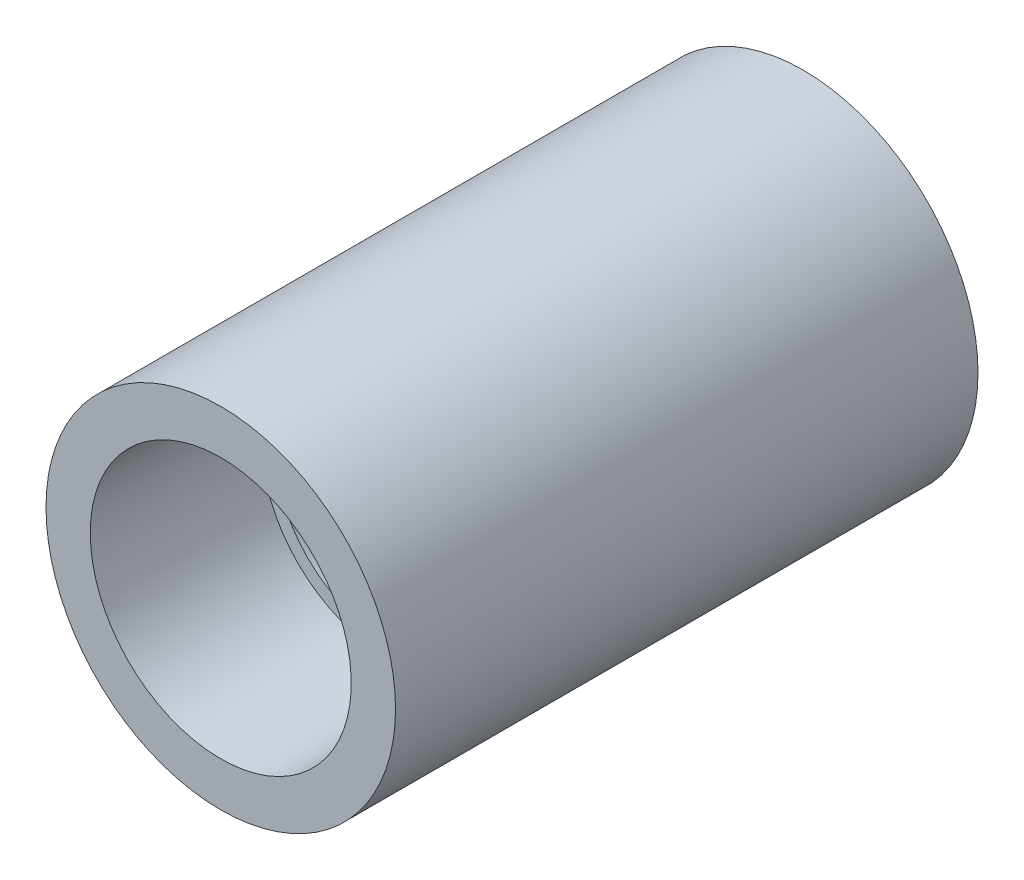
ISO-10303-21;
HEADER;
FILE_DESCRIPTION(('STEP AP214'),'2;1');
FILE_NAME('part.step','',(''),(''),'','','');
FILE_SCHEMA(('AUTOMOTIVE_DESIGN { 1 0 10303 214 1 1 1 1 }'));
ENDSEC;
DATA;
#1=APPLICATION_CONTEXT('core data for automotive mechanical design processes');
#2=APPLICATION_PROTOCOL_DEFINITION('international standard','automotive_design',2000,#1);
#3=PRODUCT_CONTEXT('',#1,'mechanical');
#4=PRODUCT('Part','Part','',(#3));
#5=PRODUCT_RELATED_PRODUCT_CATEGORY('part','',(#4));
#6=PRODUCT_DEFINITION_FORMATION('','',#4);
#7=PRODUCT_DEFINITION_CONTEXT('part definition',#1,'design');
#8=PRODUCT_DEFINITION('design','',#6,#7);
#9=PRODUCT_DEFINITION_SHAPE('','',#8);
#10=(LENGTH_UNIT() NAMED_UNIT(*) SI_UNIT(.MILLI.,.METRE.));
#11=(NAMED_UNIT(*) PLANE_ANGLE_UNIT() SI_UNIT($,.RADIAN.));
#12=(NAMED_UNIT(*) SI_UNIT($,.STERADIAN.) SOLID_ANGLE_UNIT());
#13=UNCERTAINTY_MEASURE_WITH_UNIT(LENGTH_MEASURE(1.E-05),#10,'distance_accuracy_value','');
#14=(GEOMETRIC_REPRESENTATION_CONTEXT(3) GLOBAL_UNCERTAINTY_ASSIGNED_CONTEXT((#13)) GLOBAL_UNIT_ASSIGNED_CONTEXT((#10,
#11,#12)) REPRESENTATION_CONTEXT('',''));
#15=CARTESIAN_POINT('',(0.,0.,0.));
#16=DIRECTION('',(0.,0.,1.));
#17=DIRECTION('',(1.,0.,0.));
#18=AXIS2_PLACEMENT_3D('',#15,#16,#17);
#19=CARTESIAN_POINT('',(-1.11022302462516E-12,-9.99200722162641E-13,47.625));
#20=DIRECTION('',(0.,0.,-1.));
#21=DIRECTION('',(-1.,0.,0.));
#22=AXIS2_PLACEMENT_3D('',#19,#20,#21);
#23=CYLINDRICAL_SURFACE('',#22,14.2875);
#24=CARTESIAN_POINT('',(-1.11022302462516E-12,-9.99200722162641E-13,47.625));
#25=DIRECTION('',(0.,0.,1.));
#26=DIRECTION('',(1.,0.,0.));
#27=AXIS2_PLACEMENT_3D('',#24,#25,#26);
#28=CIRCLE('',#27,14.2875);
#29=CARTESIAN_POINT('',(14.2874999999989,-1.01109745576089E-12,47.625));
#30=VERTEX_POINT('',#29);
#31=EDGE_CURVE('E10',#30,#30,#28,.T.);
#32=ORIENTED_EDGE('',*,*,#31,.F.);
#33=EDGE_LOOP('',(#32));
#34=FACE_BOUND('',#33,.T.);
#35=CARTESIAN_POINT('',(0.,0.,0.));
#36=DIRECTION('',(0.,0.,1.));
#37=DIRECTION('',(1.,0.,0.));
#38=AXIS2_PLACEMENT_3D('',#35,#36,#37);
#39=CIRCLE('',#38,14.2875);
#40=CARTESIAN_POINT('',(14.2875,0.,0.));
#41=VERTEX_POINT('',#40);
#42=EDGE_CURVE('E37',#41,#41,#39,.T.);
#43=ORIENTED_EDGE('',*,*,#42,.T.);
#44=EDGE_LOOP('',(#43));
#45=FACE_BOUND('',#44,.T.);
#46=ADVANCED_FACE('F30',(#34,#45),#23,.T.);
#47=CARTESIAN_POINT('',(-1.11022302462516E-12,-9.99200722162641E-13,47.625));
#48=DIRECTION('',(0.,0.,1.));
#49=DIRECTION('',(1.,0.,0.));
#50=AXIS2_PLACEMENT_3D('',#47,#48,#49);
#51=PLANE('',#50);
#52=CARTESIAN_POINT('',(-1.11022302462516E-12,-9.99200722162641E-13,47.625));
#53=DIRECTION('',(0.,0.,-1.));
#54=DIRECTION('',(-1.,0.,0.));
#55=AXIS2_PLACEMENT_3D('',#52,#53,#54);
#56=CIRCLE('',#55,10.668);
#57=CARTESIAN_POINT('',(-10.6680000000011,-9.90317827742615E-13,47.625));
#58=VERTEX_POINT('',#57);
#59=EDGE_CURVE('E51',#58,#58,#56,.T.);
#60=ORIENTED_EDGE('',*,*,#59,.T.);
#61=EDGE_LOOP('',(#60));
#62=FACE_BOUND('',#61,.T.);
#63=ORIENTED_EDGE('',*,*,#31,.T.);
#64=EDGE_LOOP('',(#63));
#65=FACE_BOUND('',#64,.T.);
#66=ADVANCED_FACE('F86',(#62,#65),#51,.T.);
#67=CARTESIAN_POINT('',(0.,0.,0.));
#68=DIRECTION('',(0.,0.,1.));
#69=DIRECTION('',(1.,0.,0.));
#70=AXIS2_PLACEMENT_3D('',#67,#68,#69);
#71=PLANE('',#70);
#72=CARTESIAN_POINT('',(0.,0.,0.));
#73=DIRECTION('',(0.,0.,-1.));
#74=DIRECTION('',(-1.,0.,0.));
#75=AXIS2_PLACEMENT_3D('',#72,#73,#74);
#76=CIRCLE('',#75,8.5725);
#77=CARTESIAN_POINT('',(-8.57250000000003,0.,0.));
#78=VERTEX_POINT('',#77);
#79=EDGE_CURVE('E59',#78,#78,#76,.T.);
#80=ORIENTED_EDGE('',*,*,#79,.F.);
#81=EDGE_LOOP('',(#80));
#82=FACE_BOUND('',#81,.T.);
#83=ORIENTED_EDGE('',*,*,#42,.F.);
#84=EDGE_LOOP('',(#83));
#85=FACE_BOUND('',#84,.T.);
#86=ADVANCED_FACE('F91',(#82,#85),#71,.F.);
#87=CARTESIAN_POINT('',(0.,0.,34.0613999999999));
#88=DIRECTION('',(0.,0.,-1.));
#89=DIRECTION('',(-1.,0.,0.));
#90=AXIS2_PLACEMENT_3D('',#87,#88,#89);
#91=PLANE('',#90);
#92=CARTESIAN_POINT('',(0.,0.,34.0613999999999));
#93=DIRECTION('',(0.,0.,-1.));
#94=DIRECTION('',(-1.,0.,0.));
#95=AXIS2_PLACEMENT_3D('',#92,#93,#94);
#96=CIRCLE('',#95,10.2456960498173);
#97=CARTESIAN_POINT('',(-10.2456960498173,0.,34.0613999999999));
#98=VERTEX_POINT('',#97);
#99=EDGE_CURVE('E45',#98,#98,#96,.T.);
#100=ORIENTED_EDGE('',*,*,#99,.F.);
#101=EDGE_LOOP('',(#100));
#102=FACE_BOUND('',#101,.T.);
#103=CARTESIAN_POINT('',(0.,0.,34.0613999999999));
#104=DIRECTION('',(0.,0.,-1.));
#105=DIRECTION('',(-1.,0.,0.));
#106=AXIS2_PLACEMENT_3D('',#103,#104,#105);
#107=CIRCLE('',#106,9.128125);
#108=CARTESIAN_POINT('',(9.12812500000003,-5.62712203222571E-13,34.0613999999999));
#109=VERTEX_POINT('',#108);
#110=EDGE_CURVE('E42',#109,#109,#107,.F.);
#111=ORIENTED_EDGE('',*,*,#110,.F.);
#112=EDGE_LOOP('',(#111));
#113=FACE_BOUND('',#112,.T.);
#114=ADVANCED_FACE('F97',(#102,#113),#91,.F.);
#115=CARTESIAN_POINT('',(0.,0.,34.0613999999999));
#116=DIRECTION('',(0.,0.,1.));
#117=DIRECTION('',(1.,0.,0.));
#118=AXIS2_PLACEMENT_3D('',#115,#116,#117);
#119=CONICAL_SURFACE('',#118,10.2456960498173,0.0311250383272251);
#120=ORIENTED_EDGE('',*,*,#59,.F.);
#121=EDGE_LOOP('',(#120));
#122=FACE_BOUND('',#121,.T.);
#123=ORIENTED_EDGE('',*,*,#99,.T.);
#124=EDGE_LOOP('',(#123));
#125=FACE_BOUND('',#124,.T.);
#126=ADVANCED_FACE('F102',(#122,#125),#119,.F.);
#127=CARTESIAN_POINT('',(0.,-5.55111512312578E-13,27.2796));
#128=DIRECTION('',(0.,0.,1.));
#129=DIRECTION('',(1.,0.,0.));
#130=AXIS2_PLACEMENT_3D('',#127,#128,#129);
#131=CYLINDRICAL_SURFACE('',#130,9.128125);
#132=CARTESIAN_POINT('',(0.,-5.55111512312578E-13,27.2796));
#133=DIRECTION('',(0.,0.,1.));
#134=DIRECTION('',(1.,0.,0.));
#135=AXIS2_PLACEMENT_3D('',#132,#133,#134);
#136=CIRCLE('',#135,9.128125);
#137=CARTESIAN_POINT('',(9.12812500000003,-5.62712203222571E-13,27.2796));
#138=VERTEX_POINT('',#137);
#139=EDGE_CURVE('E64',#138,#138,#136,.T.);
#140=CARTESIAN_POINT('',(9.12812500000003,-5.62712203222571E-13,34.0613999999999));
#141=CARTESIAN_POINT('',(9.12812500000003,-5.62712203222571E-13,33.9907562499999));
#142=CARTESIAN_POINT('',(9.12812500000003,-5.62712203222571E-13,33.9201124999999));
#143=CARTESIAN_POINT('',(9.12812500000003,-5.62712203222571E-13,33.7788249999999));
#144=CARTESIAN_POINT('',(9.12812500000003,-5.62712203222571E-13,33.7081812499999));
#145=CARTESIAN_POINT('',(9.12812500000003,-5.62712203222571E-13,33.5668937499999));
#146=CARTESIAN_POINT('',(9.12812500000003,-5.62712203222571E-13,33.4962499999999));
#147=CARTESIAN_POINT('',(9.12812500000003,-5.62712203222571E-13,33.3549624999999));
#148=CARTESIAN_POINT('',(9.12812500000003,-5.62712203222571E-13,33.2843187499999));
#149=CARTESIAN_POINT('',(9.12812500000003,-5.62712203222571E-13,33.1430312499999));
#150=CARTESIAN_POINT('',(9.12812500000003,-5.62712203222571E-13,33.0723874999999));
#151=CARTESIAN_POINT('',(9.12812500000003,-5.62712203222571E-13,32.9310999999999));
#152=CARTESIAN_POINT('',(9.12812500000003,-5.62712203222571E-13,32.8604562499999));
#153=CARTESIAN_POINT('',(9.12812500000003,-5.62712203222571E-13,32.7191687499999));
#154=CARTESIAN_POINT('',(9.12812500000003,-5.62712203222571E-13,32.6485249999999));
#155=CARTESIAN_POINT('',(9.12812500000003,-5.62712203222571E-13,32.5072374999999));
#156=CARTESIAN_POINT('',(9.12812500000003,-5.62712203222571E-13,32.4365937499999));
#157=CARTESIAN_POINT('',(9.12812500000003,-5.62712203222571E-13,32.2953062499999));
#158=CARTESIAN_POINT('',(9.12812500000003,-5.62712203222571E-13,32.2246624999999));
#159=CARTESIAN_POINT('',(9.12812500000003,-5.62712203222571E-13,32.0833749999999));
#160=CARTESIAN_POINT('',(9.12812500000003,-5.62712203222571E-13,32.0127312499999));
#161=CARTESIAN_POINT('',(9.12812500000003,-5.62712203222571E-13,31.8714437499999));
#162=CARTESIAN_POINT('',(9.12812500000003,-5.62712203222571E-13,31.8007999999999));
#163=CARTESIAN_POINT('',(9.12812500000003,-5.62712203222571E-13,31.6595124999999));
#164=CARTESIAN_POINT('',(9.12812500000003,-5.62712203222571E-13,31.5888687499999));
#165=CARTESIAN_POINT('',(9.12812500000003,-5.62712203222571E-13,31.4475812499999));
#166=CARTESIAN_POINT('',(9.12812500000003,-5.62712203222571E-13,31.3769374999999));
#167=CARTESIAN_POINT('',(9.12812500000003,-5.62712203222571E-13,31.2356499999999));
#168=CARTESIAN_POINT('',(9.12812500000003,-5.62712203222571E-13,31.1650062499999));
#169=CARTESIAN_POINT('',(9.12812500000003,-5.62712203222571E-13,31.0237187499999));
#170=CARTESIAN_POINT('',(9.12812500000003,-5.62712203222571E-13,30.9530749999999));
#171=CARTESIAN_POINT('',(9.12812500000003,-5.62712203222571E-13,30.8117874999999));
#172=CARTESIAN_POINT('',(9.12812500000003,-5.62712203222571E-13,30.7411437499999));
#173=CARTESIAN_POINT('',(9.12812500000003,-5.62712203222571E-13,30.5998562499999));
#174=CARTESIAN_POINT('',(9.12812500000003,-5.62712203222571E-13,30.5292124999999));
#175=CARTESIAN_POINT('',(9.12812500000003,-5.62712203222571E-13,30.3879249999999));
#176=CARTESIAN_POINT('',(9.12812500000003,-5.62712203222571E-13,30.3172812499999));
#177=CARTESIAN_POINT('',(9.12812500000003,-5.62712203222571E-13,30.1759937499999));
#178=CARTESIAN_POINT('',(9.12812500000003,-5.62712203222571E-13,30.1053499999999));
#179=CARTESIAN_POINT('',(9.12812500000003,-5.62712203222571E-13,29.9640624999999));
#180=CARTESIAN_POINT('',(9.12812500000003,-5.62712203222571E-13,29.8934187499999));
#181=CARTESIAN_POINT('',(9.12812500000003,-5.62712203222571E-13,29.7521312499999));
#182=CARTESIAN_POINT('',(9.12812500000003,-5.62712203222571E-13,29.6814874999999));
#183=CARTESIAN_POINT('',(9.12812500000003,-5.62712203222571E-13,29.5401999999999));
#184=CARTESIAN_POINT('',(9.12812500000003,-5.62712203222571E-13,29.4695562499999));
#185=CARTESIAN_POINT('',(9.12812500000003,-5.62712203222571E-13,29.3282687499999));
#186=CARTESIAN_POINT('',(9.12812500000003,-5.62712203222571E-13,29.2576249999999));
#187=CARTESIAN_POINT('',(9.12812500000003,-5.62712203222571E-13,29.1163374999999));
#188=CARTESIAN_POINT('',(9.12812500000003,-5.62712203222571E-13,29.0456937499999));
#189=CARTESIAN_POINT('',(9.12812500000003,-5.62712203222571E-13,28.9044062499999));
#190=CARTESIAN_POINT('',(9.12812500000003,-5.62712203222571E-13,28.8337624999999));
#191=CARTESIAN_POINT('',(9.12812500000003,-5.62712203222571E-13,28.6924749999999));
#192=CARTESIAN_POINT('',(9.12812500000003,-5.62712203222571E-13,28.6218312499999));
#193=CARTESIAN_POINT('',(9.12812500000003,-5.62712203222571E-13,28.4805437499999));
#194=CARTESIAN_POINT('',(9.12812500000003,-5.62712203222571E-13,28.4098999999999));
#195=CARTESIAN_POINT('',(9.12812500000003,-5.62712203222571E-13,28.2686124999999));
#196=CARTESIAN_POINT('',(9.12812500000003,-5.62712203222571E-13,28.1979687499999));
#197=CARTESIAN_POINT('',(9.12812500000003,-5.62712203222571E-13,28.05668125));
#198=CARTESIAN_POINT('',(9.12812500000003,-5.62712203222571E-13,27.9860374999999));
#199=CARTESIAN_POINT('',(9.12812500000003,-5.62712203222571E-13,27.84475));
#200=CARTESIAN_POINT('',(9.12812500000003,-5.62712203222571E-13,27.7741062499999));
#201=CARTESIAN_POINT('',(9.12812500000003,-5.62712203222571E-13,27.63281875));
#202=CARTESIAN_POINT('',(9.12812500000003,-5.62712203222571E-13,27.562175));
#203=CARTESIAN_POINT('',(9.12812500000003,-5.62712203222571E-13,27.4208875));
#204=CARTESIAN_POINT('',(9.12812500000003,-5.62712203222571E-13,27.35024375));
#205=CARTESIAN_POINT('',(9.12812500000003,-5.62712203222571E-13,27.2796));
#206=B_SPLINE_CURVE_WITH_KNOTS('',3,(#140,#141,#142,#143,#144,#145,#146,#147,#148,#149,#150,
#151,#152,#153,#154,#155,#156,#157,#158,#159,#160,#161,#162,#163,#164,#165,#166,#167,#168,#169,
#170,#171,#172,#173,#174,#175,#176,#177,#178,#179,#180,#181,#182,#183,#184,#185,#186,#187,#188,
#189,#190,#191,#192,#193,#194,#195,#196,#197,#198,#199,#200,#201,#202,#203,#204,#205),
.UNSPECIFIED.,.F.,.F.,(4,2,2,2,2,2,2,2,2,2,2,2,2,2,2,2,2,2,2,2,2,2,2,2,2,2,2,2,2,2,2,2,4),(0.,
0.211931249999998,0.423862499999997,0.635793749999995,0.847724999999994,1.05965624999999,
1.27158749999999,1.48351874999999,1.69544999999999,1.90738124999999,2.11931249999998,
2.33124374999998,2.54317499999997,2.75510624999998,2.96703749999997,3.17896874999997,
3.39089999999997,3.60283124999997,3.81476249999997,4.02669374999997,4.23862499999996,
4.45055624999996,4.66248749999996,4.87441874999996,5.08634999999996,5.29828124999996,
5.51021249999996,5.72214374999995,5.93407499999995,6.14600624999995,6.35793749999995,
6.56986874999995,6.78179999999994),.UNSPECIFIED.);
#207=EDGE_CURVE('BSEAM107',#109,#138,#206,.T.);
#208=ORIENTED_EDGE('',*,*,#110,.T.);
#209=ORIENTED_EDGE('',*,*,#139,.F.);
#210=ORIENTED_EDGE('',*,*,#207,.T.);
#211=ORIENTED_EDGE('',*,*,#207,.F.);
#212=EDGE_LOOP('',(#208,#210,#209,#211));
#213=FACE_BOUND('',#212,.T.);
#214=ADVANCED_FACE('F107',(#213),#131,.F.);
#215=CARTESIAN_POINT('',(-2.22044604925031E-13,8.25063163347462,10.3378000000001));
#216=DIRECTION('',(0.,0.,1.));
#217=DIRECTION('',(1.,0.,0.));
#218=AXIS2_PLACEMENT_3D('',#215,#216,#217);
#219=PLANE('',#218);
#220=CARTESIAN_POINT('',(2.22044604925031E-13,-4.44089209850063E-13,10.3378000000001));
#221=DIRECTION('',(0.,0.,-1.));
#222=DIRECTION('',(-1.,0.,0.));
#223=AXIS2_PLACEMENT_3D('',#220,#221,#222);
#224=CIRCLE('',#223,7.62);
#225=CARTESIAN_POINT('',(-7.6199999999998,-4.3774428526433E-13,10.3378000000001));
#226=VERTEX_POINT('',#225);
#227=EDGE_CURVE('E67',#226,#226,#224,.T.);
#228=ORIENTED_EDGE('',*,*,#227,.F.);
#229=EDGE_LOOP('',(#228));
#230=FACE_BOUND('',#229,.T.);
#231=CARTESIAN_POINT('',(2.22044604925031E-13,-4.44089209850063E-13,10.3378000000001));
#232=DIRECTION('',(0.,0.,-1.));
#233=DIRECTION('',(-1.,0.,0.));
#234=AXIS2_PLACEMENT_3D('',#231,#232,#233);
#235=CIRCLE('',#234,8.25063163347496);
#236=CARTESIAN_POINT('',(-8.25063163347477,-4.37219178944674E-13,10.3378000000001));
#237=VERTEX_POINT('',#236);
#238=EDGE_CURVE('E55',#237,#237,#235,.T.);
#239=ORIENTED_EDGE('',*,*,#238,.T.);
#240=EDGE_LOOP('',(#239));
#241=FACE_BOUND('',#240,.T.);
#242=ADVANCED_FACE('F109',(#230,#241),#219,.F.);
#243=CARTESIAN_POINT('',(0.,0.,0.));
#244=DIRECTION('',(0.,0.,-1.));
#245=DIRECTION('',(-1.,0.,0.));
#246=AXIS2_PLACEMENT_3D('',#243,#244,#245);
#247=CONICAL_SURFACE('',#246,8.5725,0.0311250383272255);
#248=ORIENTED_EDGE('',*,*,#238,.F.);
#249=EDGE_LOOP('',(#248));
#250=FACE_BOUND('',#249,.T.);
#251=ORIENTED_EDGE('',*,*,#79,.T.);
#252=EDGE_LOOP('',(#251));
#253=FACE_BOUND('',#252,.T.);
#254=ADVANCED_FACE('F83',(#250,#253),#247,.F.);
#255=CARTESIAN_POINT('',(0.,-5.55111512312578E-13,27.2796));
#256=DIRECTION('',(0.,0.,1.));
#257=DIRECTION('',(1.,0.,0.));
#258=AXIS2_PLACEMENT_3D('',#255,#256,#257);
#259=CONICAL_SURFACE('',#258,9.128125,0.5235987755983);
#260=CARTESIAN_POINT('',(0.,-5.55111512312578E-13,24.6674508758351));
#261=DIRECTION('',(0.,0.,1.));
#262=DIRECTION('',(1.,0.,0.));
#263=AXIS2_PLACEMENT_3D('',#260,#261,#262);
#264=CIRCLE('',#263,7.62);
#265=CARTESIAN_POINT('',(7.62000000000002,-5.61456436898311E-13,24.6674508758351));
#266=VERTEX_POINT('',#265);
#267=EDGE_CURVE('E33',#266,#266,#264,.F.);
#268=ORIENTED_EDGE('',*,*,#267,.T.);
#269=EDGE_LOOP('',(#268));
#270=FACE_BOUND('',#269,.T.);
#271=ORIENTED_EDGE('',*,*,#139,.T.);
#272=EDGE_LOOP('',(#271));
#273=FACE_BOUND('',#272,.T.);
#274=ADVANCED_FACE('F74',(#270,#273),#259,.F.);
#275=CARTESIAN_POINT('',(-1.11022302462516E-12,-9.99200722162641E-13,47.625));
#276=DIRECTION('',(0.,0.,-1.));
#277=DIRECTION('',(-1.,0.,0.));
#278=AXIS2_PLACEMENT_3D('',#275,#276,#277);
#279=CYLINDRICAL_SURFACE('',#278,7.62);
#280=ORIENTED_EDGE('',*,*,#227,.T.);
#281=EDGE_LOOP('',(#280));
#282=FACE_BOUND('',#281,.T.);
#283=ORIENTED_EDGE('',*,*,#267,.F.);
#284=EDGE_LOOP('',(#283));
#285=FACE_BOUND('',#284,.T.);
#286=ADVANCED_FACE('F77',(#282,#285),#279,.F.);
#287=CLOSED_SHELL('',(#46,#66,#86,#114,#126,#214,#242,#254,#274,#286));
#288=MANIFOLD_SOLID_BREP('B2',#287);
#289=ADVANCED_BREP_SHAPE_REPRESENTATION('',(#18,#288),#14);
#290=SHAPE_DEFINITION_REPRESENTATION(#9,#289);
ENDSEC;
END-ISO-10303-21;
